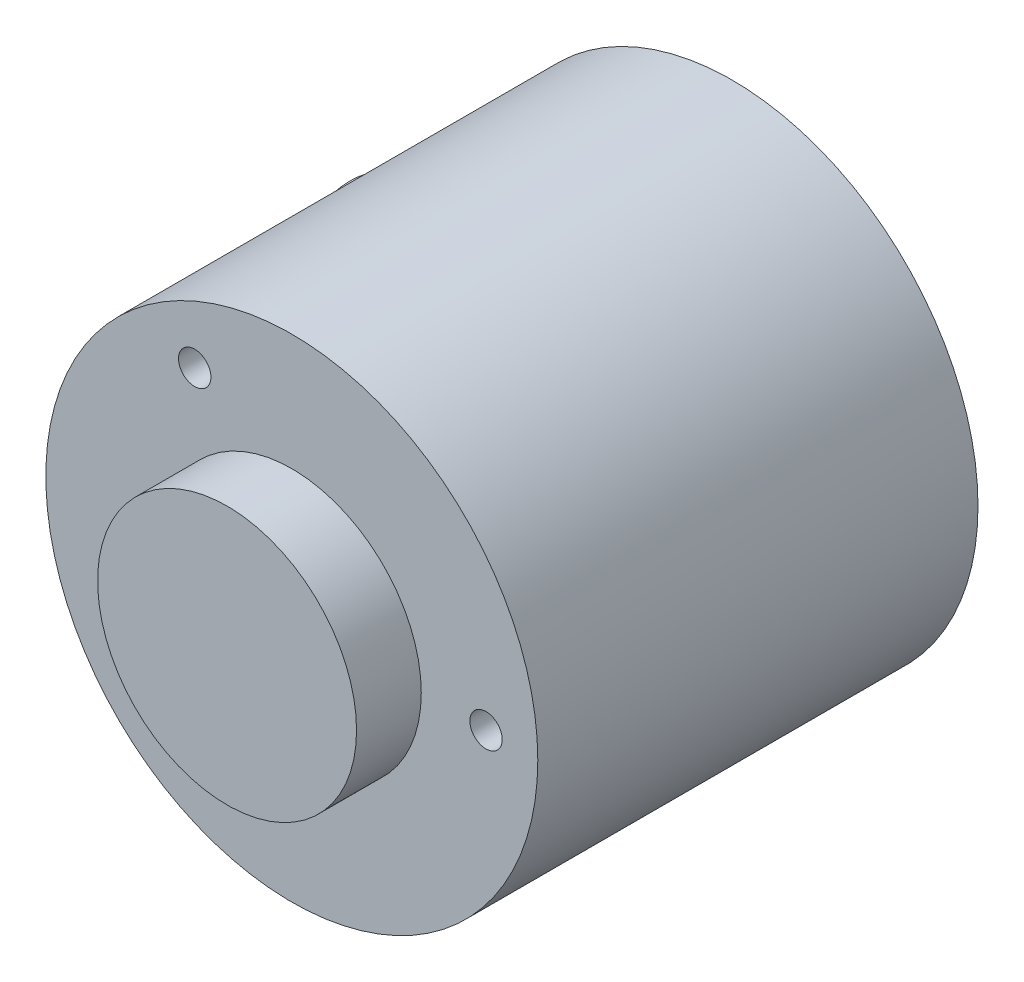
ISO-10303-21;
HEADER;
FILE_DESCRIPTION(('STEP AP214'),'2;1');
FILE_NAME('part.step','',(''),(''),'','','');
FILE_SCHEMA(('AUTOMOTIVE_DESIGN { 1 0 10303 214 1 1 1 1 }'));
ENDSEC;
DATA;
#1=APPLICATION_CONTEXT('core data for automotive mechanical design processes');
#2=APPLICATION_PROTOCOL_DEFINITION('international standard','automotive_design',2000,#1);
#3=PRODUCT_CONTEXT('',#1,'mechanical');
#4=PRODUCT('Part','Part','',(#3));
#5=PRODUCT_RELATED_PRODUCT_CATEGORY('part','',(#4));
#6=PRODUCT_DEFINITION_FORMATION('','',#4);
#7=PRODUCT_DEFINITION_CONTEXT('part definition',#1,'design');
#8=PRODUCT_DEFINITION('design','',#6,#7);
#9=PRODUCT_DEFINITION_SHAPE('','',#8);
#10=(LENGTH_UNIT() NAMED_UNIT(*) SI_UNIT(.MILLI.,.METRE.));
#11=(NAMED_UNIT(*) PLANE_ANGLE_UNIT() SI_UNIT($,.RADIAN.));
#12=(NAMED_UNIT(*) SI_UNIT($,.STERADIAN.) SOLID_ANGLE_UNIT());
#13=UNCERTAINTY_MEASURE_WITH_UNIT(LENGTH_MEASURE(1.E-05),#10,'distance_accuracy_value','');
#14=(GEOMETRIC_REPRESENTATION_CONTEXT(3) GLOBAL_UNCERTAINTY_ASSIGNED_CONTEXT((#13)) GLOBAL_UNIT_ASSIGNED_CONTEXT((#10,
#11,#12)) REPRESENTATION_CONTEXT('',''));
#15=CARTESIAN_POINT('',(0.,0.,0.));
#16=DIRECTION('',(0.,0.,1.));
#17=DIRECTION('',(1.,0.,0.));
#18=AXIS2_PLACEMENT_3D('',#15,#16,#17);
#19=CARTESIAN_POINT('',(0.,0.,0.));
#20=DIRECTION('',(0.,0.,-1.));
#21=DIRECTION('',(-1.,0.,0.));
#22=AXIS2_PLACEMENT_3D('',#19,#20,#21);
#23=CYLINDRICAL_SURFACE('',#22,19.);
#24=CARTESIAN_POINT('',(0.,0.,0.));
#25=DIRECTION('',(0.,0.,1.));
#26=DIRECTION('',(1.,0.,0.));
#27=AXIS2_PLACEMENT_3D('',#24,#25,#26);
#28=CIRCLE('',#27,19.);
#29=CARTESIAN_POINT('',(19.,0.,0.));
#30=VERTEX_POINT('',#29);
#31=EDGE_CURVE('E54',#30,#30,#28,.T.);
#32=ORIENTED_EDGE('',*,*,#31,.F.);
#33=EDGE_LOOP('',(#32));
#34=FACE_BOUND('',#33,.T.);
#35=CARTESIAN_POINT('',(0.,0.,-34.));
#36=DIRECTION('',(0.,0.,1.));
#37=DIRECTION('',(1.,0.,0.));
#38=AXIS2_PLACEMENT_3D('',#35,#36,#37);
#39=CIRCLE('',#38,19.);
#40=CARTESIAN_POINT('',(19.,0.,-34.));
#41=VERTEX_POINT('',#40);
#42=EDGE_CURVE('E59',#41,#41,#39,.T.);
#43=ORIENTED_EDGE('',*,*,#42,.T.);
#44=EDGE_LOOP('',(#43));
#45=FACE_BOUND('',#44,.T.);
#46=CARTESIAN_POINT('',(-19.,0.,-21.5));
#47=CARTESIAN_POINT('',(-18.9999957178638,0.275769326400334,-21.5000068166826));
#48=CARTESIAN_POINT('',(-18.9939369110743,0.551612339964108,-21.5228911629731));
#49=CARTESIAN_POINT('',(-18.9703552522905,1.09536084420814,-21.6136672774513));
#50=CARTESIAN_POINT('',(-18.9528266728315,1.36326229934773,-21.6815815316804));
#51=CARTESIAN_POINT('',(-18.9082415265209,1.88319959043665,-21.8600631507965));
#52=CARTESIAN_POINT('',(-18.8811970679014,2.13525511097029,-21.9705763287813));
#53=CARTESIAN_POINT('',(-18.8204430306565,2.61725305763118,-22.2309200421276));
#54=CARTESIAN_POINT('',(-18.7867330543442,2.84719416312159,-22.3807529236078));
#55=CARTESIAN_POINT('',(-18.7154388327318,3.28363987258849,-22.7190632313953));
#56=CARTESIAN_POINT('',(-18.6777897345587,3.48957269264305,-22.9082646551311));
#57=CARTESIAN_POINT('',(-18.6032800591516,3.86718169173115,-23.3183931173321));
#58=CARTESIAN_POINT('',(-18.5664195811586,4.03885358169212,-23.5393241220285));
#59=CARTESIAN_POINT('',(-18.4969993222001,4.34583417024358,-24.0111775367529));
#60=CARTESIAN_POINT('',(-18.4645214758363,4.48048899736331,-24.262538504588));
#61=CARTESIAN_POINT('',(-18.4084956128093,4.7054029505289,-24.7853242084465));
#62=CARTESIAN_POINT('',(-18.3849459974541,4.79567002552072,-25.0567453420793));
#63=CARTESIAN_POINT('',(-18.3501118941767,4.92726790269511,-25.6056238562141));
#64=CARTESIAN_POINT('',(-18.3385684873096,4.96963355234476,-25.8828162956958));
#65=CARTESIAN_POINT('',(-18.328279903082,5.00745164847048,-26.4405960113418));
#66=CARTESIAN_POINT('',(-18.3295324018157,5.00291261345676,-26.7211826618273));
#67=CARTESIAN_POINT('',(-18.3444621543897,4.9478726318895,-27.2697404589164));
#68=CARTESIAN_POINT('',(-18.3578020069334,4.89861973809088,-27.5378474675435));
#69=CARTESIAN_POINT('',(-18.3948637106681,4.75754734011486,-28.0618520074175));
#70=CARTESIAN_POINT('',(-18.4185863722508,4.66572451326531,-28.3177485838948));
#71=CARTESIAN_POINT('',(-18.4740402179201,4.4410917967273,-28.8133415741496));
#72=CARTESIAN_POINT('',(-18.5058568359772,4.30784106339798,-29.0528282081257));
#73=CARTESIAN_POINT('',(-18.573867245553,4.00444274039802,-29.5064827182955));
#74=CARTESIAN_POINT('',(-18.6100618777008,3.83428805975344,-29.7206457163974));
#75=CARTESIAN_POINT('',(-18.6841580271555,3.45551254292273,-30.1247089849091));
#76=CARTESIAN_POINT('',(-18.7220772644082,3.24584253203104,-30.3136238439592));
#77=CARTESIAN_POINT('',(-18.794319031737,2.79733618090121,-30.653809308796));
#78=CARTESIAN_POINT('',(-18.828641427274,2.55849875038486,-30.8050785067453));
#79=CARTESIAN_POINT('',(-18.8900243975419,2.05693717567475,-31.0660968599232));
#80=CARTESIAN_POINT('',(-18.9170543384444,1.79411828743571,-31.1756716336729));
#81=CARTESIAN_POINT('',(-18.9605851829004,1.25291705070341,-31.348800827592));
#82=CARTESIAN_POINT('',(-18.9770883250536,0.974538024889808,-31.4123650326278));
#83=CARTESIAN_POINT('',(-18.9973691359723,0.418531665055095,-31.490130641269));
#84=CARTESIAN_POINT('',(-19.0014922111205,0.141104095967861,-31.5056722540056));
#85=CARTESIAN_POINT('',(-18.9975393920985,-0.412392174634828,-31.4906472077487));
#86=CARTESIAN_POINT('',(-18.9894647234237,-0.688461009865306,-31.4600851807429));
#87=CARTESIAN_POINT('',(-18.9622464275131,-1.22664703082866,-31.3548209087677));
#88=CARTESIAN_POINT('',(-18.9432894848034,-1.48892004105413,-31.2808626599302));
#89=CARTESIAN_POINT('',(-18.8964538133382,-1.99731390900085,-31.0917662589128));
#90=CARTESIAN_POINT('',(-18.8685741310162,-2.24343303697949,-30.9766237052422));
#91=CARTESIAN_POINT('',(-18.8061722513547,-2.71776721238244,-30.7059173557337));
#92=CARTESIAN_POINT('',(-18.7715327802268,-2.9455476981359,-30.5496198208559));
#93=CARTESIAN_POINT('',(-18.6996172131604,-3.3721194516033,-30.201965939219));
#94=CARTESIAN_POINT('',(-18.6623406114053,-3.5709051354408,-30.0106028554353));
#95=CARTESIAN_POINT('',(-18.5880870950829,-3.93946537763554,-29.5920019785961));
#96=CARTESIAN_POINT('',(-18.5511463973769,-4.10829545608396,-29.3639246733161));
#97=CARTESIAN_POINT('',(-18.4828739909468,-4.40530154568804,-28.8818990077423));
#98=CARTESIAN_POINT('',(-18.451542043772,-4.5334792853183,-28.6279517480057));
#99=CARTESIAN_POINT('',(-18.3983923637822,-4.74457728048384,-28.1026875308703));
#100=CARTESIAN_POINT('',(-18.3765192543105,-4.82776168851186,-27.8314826376852));
#101=CARTESIAN_POINT('',(-18.3447420107922,-4.94715371079317,-27.2782635455097));
#102=CARTESIAN_POINT('',(-18.3348349151139,-4.98337294925862,-26.9962520390304));
#103=CARTESIAN_POINT('',(-18.3283542048942,-5.00715081173977,-26.4390816445491));
#104=CARTESIAN_POINT('',(-18.3313651360785,-4.99622557405378,-26.1639913092843));
#105=CARTESIAN_POINT('',(-18.3494111434725,-4.92953140114559,-25.6197239915658));
#106=CARTESIAN_POINT('',(-18.3644459254539,-4.87376356323929,-25.3505468645792));
#107=CARTESIAN_POINT('',(-18.404601627765,-4.71983552306685,-24.8275990970383));
#108=CARTESIAN_POINT('',(-18.4296479062774,-4.6219886449165,-24.5737300978352));
#109=CARTESIAN_POINT('',(-18.487008102539,-4.38692411825137,-24.0858216725245));
#110=CARTESIAN_POINT('',(-18.5193231325886,-4.24970044321719,-23.851785288856));
#111=CARTESIAN_POINT('',(-18.5887388284062,-3.93514861806089,-23.4029291748367));
#112=CARTESIAN_POINT('',(-18.6259502628499,-3.75678207589861,-23.1888541648539));
#113=CARTESIAN_POINT('',(-18.7003384349729,-3.36699304774797,-22.7931811732781));
#114=CARTESIAN_POINT('',(-18.7375151620875,-3.15556257964814,-22.6115910567644));
#115=CARTESIAN_POINT('',(-18.8085635163672,-2.7003741726027,-22.2823595072887));
#116=CARTESIAN_POINT('',(-18.8423509547618,-2.45603841361694,-22.1354972805196));
#117=CARTESIAN_POINT('',(-18.9019003201304,-1.94526775833222,-21.8851650988127));
#118=CARTESIAN_POINT('',(-18.9276675250045,-1.67884754204237,-21.7816665917876));
#119=CARTESIAN_POINT('',(-18.9648374183622,-1.17775159305369,-21.6349038196958));
#120=CARTESIAN_POINT('',(-18.9779285000888,-0.945286703979936,-21.5844305989306));
#121=CARTESIAN_POINT('',(-18.9955112347954,-0.475232463380953,-21.5169773144475));
#122=CARTESIAN_POINT('',(-19.0000036901212,-0.237643592071626,-21.4999941257392));
#123=CARTESIAN_POINT('',(-19.,0.,-21.5));
#124=B_SPLINE_CURVE_WITH_KNOTS('',3,(#46,#47,#48,#49,#50,#51,#52,#53,#54,#55,#56,#57,#58,#59,
#60,#61,#62,#63,#64,#65,#66,#67,#68,#69,#70,#71,#72,#73,#74,#75,#76,#77,#78,#79,#80,#81,#82,#83,
#84,#85,#86,#87,#88,#89,#90,#91,#92,#93,#94,#95,#96,#97,#98,#99,#100,#101,#102,#103,#104,#105,
#106,#107,#108,#109,#110,#111,#112,#113,#114,#115,#116,#117,#118,#119,#120,#121,#122,#123),
.UNSPECIFIED.,.T.,.F.,(4,2,2,2,2,2,2,2,2,2,2,2,2,2,2,2,2,2,2,2,2,2,2,2,2,2,2,2,2,2,2,2,2,2,2,2,
2,2,4),(0.,0.826436614585059,1.65328622796854,2.47908752031453,3.30493809758613,
4.14758534874995,4.99033802353204,5.84713921235247,6.70378690953223,7.54155141820608,
8.37916378045474,9.19409222959364,10.0090842963108,10.8330642107705,11.6572025907903,
12.5074895148544,13.35780823238,14.2116451980492,15.0653005285529,15.8949065177972,
16.7244291628853,17.5401294360794,18.3559169116766,19.187369712665,20.0189824256652,
20.873388302508,21.7277578464622,22.577055451357,23.4261428089293,24.2481310576987,
25.0700991927074,25.8860500675688,26.702125888318,27.5416338064332,28.3813447077047,
29.2384104629446,30.0949110079133,30.8071573512508,31.5193372309826),.UNSPECIFIED.);
#125=CARTESIAN_POINT('',(-19.,0.,-21.5));
#126=VERTEX_POINT('',#125);
#127=EDGE_CURVE('E10',#126,#126,#124,.T.);
#128=ORIENTED_EDGE('',*,*,#127,.F.);
#129=EDGE_LOOP('',(#128));
#130=FACE_BOUND('',#129,.T.);
#131=ADVANCED_FACE('F39',(#34,#45,#130),#23,.T.);
#132=CARTESIAN_POINT('',(0.,0.,0.));
#133=DIRECTION('',(0.,0.,1.));
#134=DIRECTION('',(1.,0.,0.));
#135=AXIS2_PLACEMENT_3D('',#132,#133,#134);
#136=PLANE('',#135);
#137=CARTESIAN_POINT('',(15.,0.,0.));
#138=DIRECTION('',(0.,0.,1.));
#139=DIRECTION('',(1.,0.,0.));
#140=AXIS2_PLACEMENT_3D('',#137,#138,#139);
#141=CIRCLE('',#140,1.25);
#142=CARTESIAN_POINT('',(16.25,0.,0.));
#143=VERTEX_POINT('',#142);
#144=EDGE_CURVE('E76',#143,#143,#141,.T.);
#145=ORIENTED_EDGE('',*,*,#144,.F.);
#146=EDGE_LOOP('',(#145));
#147=FACE_BOUND('',#146,.T.);
#148=CARTESIAN_POINT('',(-7.5,12.9903810567666,0.));
#149=DIRECTION('',(0.,0.,1.));
#150=DIRECTION('',(1.,0.,0.));
#151=AXIS2_PLACEMENT_3D('',#148,#149,#150);
#152=CIRCLE('',#151,1.25);
#153=CARTESIAN_POINT('',(-6.25,12.9903810567666,0.));
#154=VERTEX_POINT('',#153);
#155=EDGE_CURVE('E88',#154,#154,#152,.T.);
#156=ORIENTED_EDGE('',*,*,#155,.F.);
#157=EDGE_LOOP('',(#156));
#158=FACE_BOUND('',#157,.T.);
#159=CARTESIAN_POINT('',(-7.50000000000001,-12.9903810567666,0.));
#160=DIRECTION('',(0.,0.,1.));
#161=DIRECTION('',(1.,0.,0.));
#162=AXIS2_PLACEMENT_3D('',#159,#160,#161);
#163=CIRCLE('',#162,1.25);
#164=CARTESIAN_POINT('',(-6.25000000000001,-12.9903810567666,0.));
#165=VERTEX_POINT('',#164);
#166=EDGE_CURVE('E82',#165,#165,#163,.T.);
#167=ORIENTED_EDGE('',*,*,#166,.F.);
#168=EDGE_LOOP('',(#167));
#169=FACE_BOUND('',#168,.T.);
#170=CARTESIAN_POINT('',(0.,0.,0.));
#171=DIRECTION('',(0.,0.,1.));
#172=DIRECTION('',(1.,0.,0.));
#173=AXIS2_PLACEMENT_3D('',#170,#171,#172);
#174=CIRCLE('',#173,10.);
#175=CARTESIAN_POINT('',(10.,0.,0.));
#176=VERTEX_POINT('',#175);
#177=EDGE_CURVE('E50',#176,#176,#174,.T.);
#178=ORIENTED_EDGE('',*,*,#177,.F.);
#179=EDGE_LOOP('',(#178));
#180=FACE_BOUND('',#179,.T.);
#181=ORIENTED_EDGE('',*,*,#31,.T.);
#182=EDGE_LOOP('',(#181));
#183=FACE_BOUND('',#182,.T.);
#184=ADVANCED_FACE('F96',(#147,#158,#169,#180,#183),#136,.T.);
#185=CARTESIAN_POINT('',(0.,0.,-34.));
#186=DIRECTION('',(0.,0.,1.));
#187=DIRECTION('',(1.,0.,0.));
#188=AXIS2_PLACEMENT_3D('',#185,#186,#187);
#189=PLANE('',#188);
#190=ORIENTED_EDGE('',*,*,#42,.F.);
#191=EDGE_LOOP('',(#190));
#192=FACE_BOUND('',#191,.T.);
#193=ADVANCED_FACE('F99',(#192),#189,.F.);
#194=CARTESIAN_POINT('',(0.,0.,5.));
#195=DIRECTION('',(0.,0.,-1.));
#196=DIRECTION('',(-1.,0.,0.));
#197=AXIS2_PLACEMENT_3D('',#194,#195,#196);
#198=CYLINDRICAL_SURFACE('',#197,10.);
#199=CARTESIAN_POINT('',(0.,0.,5.));
#200=DIRECTION('',(0.,0.,1.));
#201=DIRECTION('',(1.,0.,0.));
#202=AXIS2_PLACEMENT_3D('',#199,#200,#201);
#203=CIRCLE('',#202,10.);
#204=CARTESIAN_POINT('',(10.,0.,5.));
#205=VERTEX_POINT('',#204);
#206=EDGE_CURVE('E62',#205,#205,#203,.T.);
#207=ORIENTED_EDGE('',*,*,#206,.F.);
#208=EDGE_LOOP('',(#207));
#209=FACE_BOUND('',#208,.T.);
#210=ORIENTED_EDGE('',*,*,#177,.T.);
#211=EDGE_LOOP('',(#210));
#212=FACE_BOUND('',#211,.T.);
#213=ADVANCED_FACE('F206',(#209,#212),#198,.T.);
#214=CARTESIAN_POINT('',(0.,0.,5.));
#215=DIRECTION('',(0.,0.,1.));
#216=DIRECTION('',(1.,0.,0.));
#217=AXIS2_PLACEMENT_3D('',#214,#215,#216);
#218=PLANE('',#217);
#219=ORIENTED_EDGE('',*,*,#206,.T.);
#220=EDGE_LOOP('',(#219));
#221=FACE_BOUND('',#220,.T.);
#222=ADVANCED_FACE('F118',(#221),#218,.T.);
#223=CARTESIAN_POINT('',(-17.,0.,-26.5));
#224=DIRECTION('',(-1.,0.,0.));
#225=DIRECTION('',(0.,0.,1.));
#226=AXIS2_PLACEMENT_3D('',#223,#224,#225);
#227=CYLINDRICAL_SURFACE('',#226,5.);
#228=CARTESIAN_POINT('',(-22.,0.,-26.5));
#229=DIRECTION('',(1.,0.,0.));
#230=DIRECTION('',(0.,0.,-1.));
#231=AXIS2_PLACEMENT_3D('',#228,#229,#230);
#232=CIRCLE('',#231,5.);
#233=CARTESIAN_POINT('',(-22.,0.,-31.5));
#234=VERTEX_POINT('',#233);
#235=EDGE_CURVE('E68',#234,#234,#232,.T.);
#236=ORIENTED_EDGE('',*,*,#235,.T.);
#237=EDGE_LOOP('',(#236));
#238=FACE_BOUND('',#237,.T.);
#239=ORIENTED_EDGE('',*,*,#127,.T.);
#240=EDGE_LOOP('',(#239));
#241=FACE_BOUND('',#240,.T.);
#242=ADVANCED_FACE('F122',(#238,#241),#227,.T.);
#243=CARTESIAN_POINT('',(-22.,0.,-26.5));
#244=DIRECTION('',(1.,0.,0.));
#245=DIRECTION('',(0.,0.,-1.));
#246=AXIS2_PLACEMENT_3D('',#243,#244,#245);
#247=PLANE('',#246);
#248=ORIENTED_EDGE('',*,*,#235,.F.);
#249=EDGE_LOOP('',(#248));
#250=FACE_BOUND('',#249,.T.);
#251=ADVANCED_FACE('F126',(#250),#247,.F.);
#252=CARTESIAN_POINT('',(-7.50000000000001,-12.9903810567666,-6.));
#253=DIRECTION('',(0.,0.,1.));
#254=DIRECTION('',(1.,0.,0.));
#255=AXIS2_PLACEMENT_3D('',#252,#253,#254);
#256=CYLINDRICAL_SURFACE('',#255,1.25);
#257=CARTESIAN_POINT('',(-7.50000000000001,-12.9903810567666,-6.));
#258=DIRECTION('',(0.,0.,1.));
#259=DIRECTION('',(1.,0.,0.));
#260=AXIS2_PLACEMENT_3D('',#257,#258,#259);
#261=CIRCLE('',#260,1.25);
#262=CARTESIAN_POINT('',(-6.25000000000001,-12.9903810567666,-6.));
#263=VERTEX_POINT('',#262);
#264=EDGE_CURVE('E79',#263,#263,#261,.T.);
#265=ORIENTED_EDGE('',*,*,#264,.F.);
#266=EDGE_LOOP('',(#265));
#267=FACE_BOUND('',#266,.T.);
#268=ORIENTED_EDGE('',*,*,#166,.T.);
#269=EDGE_LOOP('',(#268));
#270=FACE_BOUND('',#269,.T.);
#271=ADVANCED_FACE('F131',(#267,#270),#256,.F.);
#272=CARTESIAN_POINT('',(-7.50000000000001,-12.9903810567666,-6.));
#273=DIRECTION('',(0.,0.,1.));
#274=DIRECTION('',(1.,0.,0.));
#275=AXIS2_PLACEMENT_3D('',#272,#273,#274);
#276=PLANE('',#275);
#277=ORIENTED_EDGE('',*,*,#264,.T.);
#278=EDGE_LOOP('',(#277));
#279=FACE_BOUND('',#278,.T.);
#280=ADVANCED_FACE('F147',(#279),#276,.T.);
#281=CARTESIAN_POINT('',(-7.5,12.9903810567666,-6.));
#282=DIRECTION('',(0.,0.,1.));
#283=DIRECTION('',(1.,0.,0.));
#284=AXIS2_PLACEMENT_3D('',#281,#282,#283);
#285=CYLINDRICAL_SURFACE('',#284,1.25);
#286=CARTESIAN_POINT('',(-7.5,12.9903810567666,-6.));
#287=DIRECTION('',(0.,0.,1.));
#288=DIRECTION('',(1.,0.,0.));
#289=AXIS2_PLACEMENT_3D('',#286,#287,#288);
#290=CIRCLE('',#289,1.25);
#291=CARTESIAN_POINT('',(-6.25,12.9903810567666,-6.));
#292=VERTEX_POINT('',#291);
#293=EDGE_CURVE('E85',#292,#292,#290,.T.);
#294=ORIENTED_EDGE('',*,*,#293,.F.);
#295=EDGE_LOOP('',(#294));
#296=FACE_BOUND('',#295,.T.);
#297=ORIENTED_EDGE('',*,*,#155,.T.);
#298=EDGE_LOOP('',(#297));
#299=FACE_BOUND('',#298,.T.);
#300=ADVANCED_FACE('F156',(#296,#299),#285,.F.);
#301=CARTESIAN_POINT('',(-7.5,12.9903810567666,-6.));
#302=DIRECTION('',(0.,0.,1.));
#303=DIRECTION('',(1.,0.,0.));
#304=AXIS2_PLACEMENT_3D('',#301,#302,#303);
#305=PLANE('',#304);
#306=ORIENTED_EDGE('',*,*,#293,.T.);
#307=EDGE_LOOP('',(#306));
#308=FACE_BOUND('',#307,.T.);
#309=ADVANCED_FACE('F165',(#308),#305,.T.);
#310=CARTESIAN_POINT('',(15.,0.,-6.));
#311=DIRECTION('',(0.,0.,1.));
#312=DIRECTION('',(1.,0.,0.));
#313=AXIS2_PLACEMENT_3D('',#310,#311,#312);
#314=CYLINDRICAL_SURFACE('',#313,1.25);
#315=CARTESIAN_POINT('',(15.,0.,-6.));
#316=DIRECTION('',(0.,0.,1.));
#317=DIRECTION('',(1.,0.,0.));
#318=AXIS2_PLACEMENT_3D('',#315,#316,#317);
#319=CIRCLE('',#318,1.25);
#320=CARTESIAN_POINT('',(16.25,0.,-6.));
#321=VERTEX_POINT('',#320);
#322=EDGE_CURVE('E72',#321,#321,#319,.T.);
#323=ORIENTED_EDGE('',*,*,#322,.F.);
#324=EDGE_LOOP('',(#323));
#325=FACE_BOUND('',#324,.T.);
#326=ORIENTED_EDGE('',*,*,#144,.T.);
#327=EDGE_LOOP('',(#326));
#328=FACE_BOUND('',#327,.T.);
#329=ADVANCED_FACE('F94',(#325,#328),#314,.F.);
#330=CARTESIAN_POINT('',(15.,0.,-6.));
#331=DIRECTION('',(0.,0.,1.));
#332=DIRECTION('',(1.,0.,0.));
#333=AXIS2_PLACEMENT_3D('',#330,#331,#332);
#334=PLANE('',#333);
#335=ORIENTED_EDGE('',*,*,#322,.T.);
#336=EDGE_LOOP('',(#335));
#337=FACE_BOUND('',#336,.T.);
#338=ADVANCED_FACE('F182',(#337),#334,.T.);
#339=CLOSED_SHELL('',(#131,#184,#193,#213,#222,#242,#251,#271,#280,#300,#309,#329,#338));
#340=MANIFOLD_SOLID_BREP('B2',#339);
#341=ADVANCED_BREP_SHAPE_REPRESENTATION('',(#18,#340),#14);
#342=SHAPE_DEFINITION_REPRESENTATION(#9,#341);
ENDSEC;
END-ISO-10303-21;
